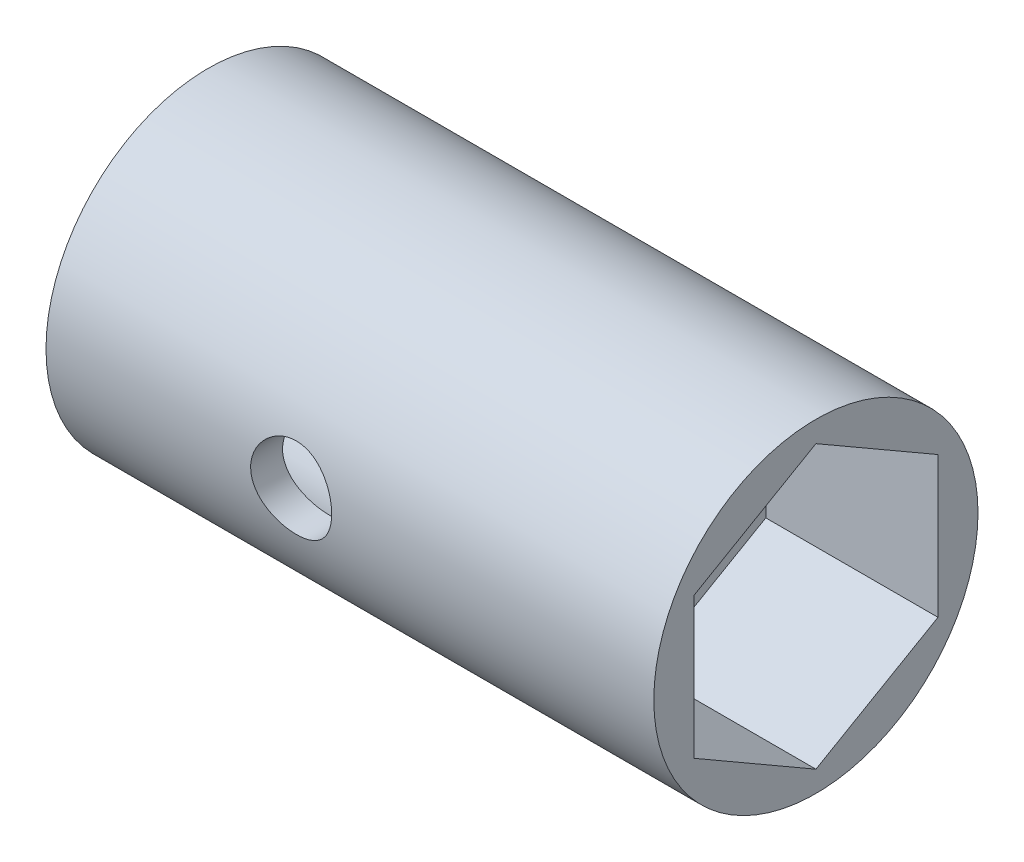
ISO-10303-21;
HEADER;
FILE_DESCRIPTION(('STEP AP214'),'2;1');
FILE_NAME('part.step','',(''),(''),'','','');
FILE_SCHEMA(('AUTOMOTIVE_DESIGN { 1 0 10303 214 1 1 1 1 }'));
ENDSEC;
DATA;
#1=APPLICATION_CONTEXT('core data for automotive mechanical design processes');
#2=APPLICATION_PROTOCOL_DEFINITION('international standard','automotive_design',2000,#1);
#3=PRODUCT_CONTEXT('',#1,'mechanical');
#4=PRODUCT('Part','Part','',(#3));
#5=PRODUCT_RELATED_PRODUCT_CATEGORY('part','',(#4));
#6=PRODUCT_DEFINITION_FORMATION('','',#4);
#7=PRODUCT_DEFINITION_CONTEXT('part definition',#1,'design');
#8=PRODUCT_DEFINITION('design','',#6,#7);
#9=PRODUCT_DEFINITION_SHAPE('','',#8);
#10=(LENGTH_UNIT() NAMED_UNIT(*) SI_UNIT(.MILLI.,.METRE.));
#11=(NAMED_UNIT(*) PLANE_ANGLE_UNIT() SI_UNIT($,.RADIAN.));
#12=(NAMED_UNIT(*) SI_UNIT($,.STERADIAN.) SOLID_ANGLE_UNIT());
#13=UNCERTAINTY_MEASURE_WITH_UNIT(LENGTH_MEASURE(1.E-05),#10,'distance_accuracy_value','');
#14=(GEOMETRIC_REPRESENTATION_CONTEXT(3) GLOBAL_UNCERTAINTY_ASSIGNED_CONTEXT((#13)) GLOBAL_UNIT_ASSIGNED_CONTEXT((#10,
#11,#12)) REPRESENTATION_CONTEXT('',''));
#15=CARTESIAN_POINT('',(0.,0.,0.));
#16=DIRECTION('',(0.,0.,1.));
#17=DIRECTION('',(1.,0.,0.));
#18=AXIS2_PLACEMENT_3D('',#15,#16,#17);
#19=CARTESIAN_POINT('',(20.,0.,0.));
#20=DIRECTION('',(-1.,0.,0.));
#21=DIRECTION('',(0.,0.,1.));
#22=AXIS2_PLACEMENT_3D('',#19,#20,#21);
#23=CYLINDRICAL_SURFACE('',#22,8.);
#24=CARTESIAN_POINT('',(20.,0.,0.));
#25=DIRECTION('',(1.,0.,0.));
#26=DIRECTION('',(0.,0.,-1.));
#27=AXIS2_PLACEMENT_3D('',#24,#25,#26);
#28=CIRCLE('',#27,8.);
#29=CARTESIAN_POINT('',(20.,0.,-8.));
#30=VERTEX_POINT('',#29);
#31=EDGE_CURVE('E11',#30,#30,#28,.T.);
#32=ORIENTED_EDGE('',*,*,#31,.F.);
#33=EDGE_LOOP('',(#32));
#34=FACE_BOUND('',#33,.T.);
#35=CARTESIAN_POINT('',(0.0999999999999998,0.,-8.));
#36=CARTESIAN_POINT('',(0.100003100984211,0.110501451559641,-7.9999981315735));
#37=CARTESIAN_POINT('',(0.10918873436505,0.221037543774351,-7.99768770842435));
#38=CARTESIAN_POINT('',(0.145633535076007,0.438941765027377,-7.98869485106526));
#39=CARTESIAN_POINT('',(0.172902946050467,0.546308062494319,-7.98200993893301));
#40=CARTESIAN_POINT('',(0.244585671282781,0.754694496243436,-7.96500835109376));
#41=CARTESIAN_POINT('',(0.288978398287026,0.855722084573336,-7.95469603789411));
#42=CARTESIAN_POINT('',(0.393575186726456,1.04889617587257,-7.93153791743495));
#43=CARTESIAN_POINT('',(0.453779781491956,1.14104237913168,-7.91869202472209));
#44=CARTESIAN_POINT('',(0.589601052872241,1.31573590306789,-7.89156551455591));
#45=CARTESIAN_POINT('',(0.665482099945414,1.39807425341474,-7.87726276197502));
#46=CARTESIAN_POINT('',(0.829936273212046,1.54899856960443,-7.84898160157248));
#47=CARTESIAN_POINT('',(0.918510830595915,1.61758298259892,-7.83500323053157));
#48=CARTESIAN_POINT('',(1.10746030231599,1.74003539039863,-7.80873034264225));
#49=CARTESIAN_POINT('',(1.20799097441164,1.79366962123352,-7.79646392619748));
#50=CARTESIAN_POINT('',(1.41699788221338,1.88319587806766,-7.77532659757355));
#51=CARTESIAN_POINT('',(1.52547284444269,1.91909074058685,-7.76645514259225));
#52=CARTESIAN_POINT('',(1.74499133093555,1.97140644907302,-7.7533396892843));
#53=CARTESIAN_POINT('',(1.85593986138399,1.98820302444274,-7.74900654662681));
#54=CARTESIAN_POINT('',(2.07915809199913,2.00301570008855,-7.74519149946122));
#55=CARTESIAN_POINT('',(2.19142757425618,2.00103485575748,-7.74570880570571));
#56=CARTESIAN_POINT('',(2.4112210769938,1.97864869951961,-7.75145607355756));
#57=CARTESIAN_POINT('',(2.51879416195377,1.95869112025418,-7.75657150676391));
#58=CARTESIAN_POINT('',(2.72901473454808,1.90163224920399,-7.77075612894758));
#59=CARTESIAN_POINT('',(2.83166187070523,1.86452973609252,-7.77982559958985));
#60=CARTESIAN_POINT('',(3.03031735500284,1.77385263724958,-7.80100151874212));
#61=CARTESIAN_POINT('',(3.12624822905276,1.72011555631056,-7.81313769959755));
#62=CARTESIAN_POINT('',(3.30789161300909,1.59780836801993,-7.83906281127988));
#63=CARTESIAN_POINT('',(3.39360233075634,1.52923566507845,-7.85285203112837));
#64=CARTESIAN_POINT('',(3.55493815425921,1.37688456624163,-7.88101174053188));
#65=CARTESIAN_POINT('',(3.63020598674847,1.29272834422115,-7.89538759304001));
#66=CARTESIAN_POINT('',(3.7656283232852,1.11281589000493,-7.92274620771675));
#67=CARTESIAN_POINT('',(3.82578236568475,1.01705930361059,-7.93572892732543));
#68=CARTESIAN_POINT('',(3.92940078163252,0.816154518241856,-7.9589030945892));
#69=CARTESIAN_POINT('',(3.97280712033924,0.710975190944831,-7.96908480170303));
#70=CARTESIAN_POINT('',(4.04122307427943,0.49450134419051,-7.98543889321888));
#71=CARTESIAN_POINT('',(4.06623620855752,0.383207998867312,-7.99161204452374));
#72=CARTESIAN_POINT('',(4.09661008741178,0.160719960520035,-7.999139990285));
#73=CARTESIAN_POINT('',(4.1024573681004,0.0495956266509453,-8.00061404677705));
#74=CARTESIAN_POINT('',(4.09566799725935,-0.172043833068678,-7.99891739752601));
#75=CARTESIAN_POINT('',(4.08303300960116,-0.282559012859461,-7.99574710989128));
#76=CARTESIAN_POINT('',(4.04003878881149,-0.498152358368656,-7.98519441503143));
#77=CARTESIAN_POINT('',(4.00994498203069,-0.603286825291673,-7.97787512247748));
#78=CARTESIAN_POINT('',(3.93319055462874,-0.807009723270015,-7.95984942178845));
#79=CARTESIAN_POINT('',(3.88652826091577,-0.905597492043513,-7.94914267159856));
#80=CARTESIAN_POINT('',(3.7770184948337,-1.0953641792398,-7.92524410568414));
#81=CARTESIAN_POINT('',(3.71389851680432,-1.18638058911444,-7.91201156489243));
#82=CARTESIAN_POINT('',(3.57361345493737,-1.35670215152433,-7.88459345583226));
#83=CARTESIAN_POINT('',(3.49644594717746,-1.43600527863068,-7.87040772335606));
#84=CARTESIAN_POINT('',(3.32799738554071,-1.58265409076364,-7.84225275947695));
#85=CARTESIAN_POINT('',(3.23641639599677,-1.64965849016271,-7.82829738916375));
#86=CARTESIAN_POINT('',(3.04302315404571,-1.7673476786836,-7.80257171169652));
#87=CARTESIAN_POINT('',(2.94121135605366,-1.81803319221058,-7.79080130756035));
#88=CARTESIAN_POINT('',(2.7307923701159,-1.90126856081239,-7.77090792979553));
#89=CARTESIAN_POINT('',(2.62222982887466,-1.93392586220542,-7.76276340389207));
#90=CARTESIAN_POINT('',(2.40092048281452,-1.98046087993837,-7.75102325453578));
#91=CARTESIAN_POINT('',(2.28817459862335,-1.99434270330488,-7.74742663626581));
#92=CARTESIAN_POINT('',(2.06517196819306,-2.00271812044533,-7.74526534938609));
#93=CARTESIAN_POINT('',(1.95493675316703,-1.99775719704016,-7.74655910304352));
#94=CARTESIAN_POINT('',(1.73692814844269,-1.96983637108382,-7.7537054534379));
#95=CARTESIAN_POINT('',(1.62915470931513,-1.94687683024903,-7.75955795855809));
#96=CARTESIAN_POINT('',(1.41972205457946,-1.88390842592373,-7.77508347576963));
#97=CARTESIAN_POINT('',(1.31803025967972,-1.84400187290717,-7.78473353648412));
#98=CARTESIAN_POINT('',(1.12271282304841,-1.74835321814009,-7.80677007633105));
#99=CARTESIAN_POINT('',(1.02908830241744,-1.69260892004558,-7.81915693494364));
#100=CARTESIAN_POINT('',(0.849927161330639,-1.56515699818285,-7.8456751235135));
#101=CARTESIAN_POINT('',(0.764665235434722,-1.49307088388301,-7.85984353109009));
#102=CARTESIAN_POINT('',(0.607270606939457,-1.33571916158631,-7.88810702995048));
#103=CARTESIAN_POINT('',(0.535141026516041,-1.25045042834819,-7.90220210302746));
#104=CARTESIAN_POINT('',(0.404784921913857,-1.06729011560345,-7.92903540863551));
#105=CARTESIAN_POINT('',(0.346833848437894,-0.969197896421849,-7.94174444487824));
#106=CARTESIAN_POINT('',(0.248336716079293,-0.764354746013968,-7.96406566633491));
#107=CARTESIAN_POINT('',(0.207778185801952,-0.657610084582319,-7.97368006933042));
#108=CARTESIAN_POINT('',(0.151237559560462,-0.459213670991295,-7.98730746087389));
#109=CARTESIAN_POINT('',(0.132065009262089,-0.368506894544091,-7.9920344673692));
#110=CARTESIAN_POINT('',(0.106445408504078,-0.185208095381711,-7.99838140309264));
#111=CARTESIAN_POINT('',(0.0999974009262649,-0.0926162149901548,-8.00000156601193));
#112=CARTESIAN_POINT('',(0.0999999999999998,0.,-8.));
#113=B_SPLINE_CURVE_WITH_KNOTS('',3,(#35,#36,#37,#38,#39,#40,#41,#42,#43,#44,#45,#46,#47,#48,
#49,#50,#51,#52,#53,#54,#55,#56,#57,#58,#59,#60,#61,#62,#63,#64,#65,#66,#67,#68,#69,#70,#71,#72,
#73,#74,#75,#76,#77,#78,#79,#80,#81,#82,#83,#84,#85,#86,#87,#88,#89,#90,#91,#92,#93,#94,#95,#96,
#97,#98,#99,#100,#101,#102,#103,#104,#105,#106,#107,#108,#109,#110,#111,#112),.UNSPECIFIED.,.T.,
.F.,(4,2,2,2,2,2,2,2,2,2,2,2,2,2,2,2,2,2,2,2,2,2,2,2,2,2,2,2,2,2,2,2,2,2,2,2,2,2,4),(0.,
0.33116494996252,0.662517650351866,0.993473203048141,1.32443992022577,1.66152580582852,
1.99864972773416,2.34078196727742,2.68285948225824,3.01808393468093,3.3532538415469,
3.68029996013785,4.00736937959146,4.337740371696,4.66816921119311,5.00802001296453,
5.34788119415424,5.6889097201658,6.02987298255951,6.36211078603463,6.69431868154751,
7.02160366023144,7.34892169767482,7.68204783424897,8.01523150681786,8.35659345610396,
8.69794025003772,9.03723006156476,9.37644564340971,9.70591707202578,10.0353818794581,
10.3628853408369,10.6904342418696,11.0265276855097,11.3627009303165,11.7049624733721,
12.0469781843289,12.3245632392729,12.6021274139515),.UNSPECIFIED.);
#114=CARTESIAN_POINT('',(0.0999999999999998,0.,-8.));
#115=VERTEX_POINT('',#114);
#116=EDGE_CURVE('E182',#115,#115,#113,.T.);
#117=ORIENTED_EDGE('',*,*,#116,.F.);
#118=EDGE_LOOP('',(#117));
#119=FACE_BOUND('',#118,.T.);
#120=CARTESIAN_POINT('',(4.1,0.,8.));
#121=CARTESIAN_POINT('',(4.09999689901579,0.110501451559641,7.9999981315735));
#122=CARTESIAN_POINT('',(4.09081126563495,0.221037543774351,7.99768770842435));
#123=CARTESIAN_POINT('',(4.05436646492399,0.438941765027377,7.98869485106526));
#124=CARTESIAN_POINT('',(4.02709705394953,0.546308062494319,7.98200993893301));
#125=CARTESIAN_POINT('',(3.95541432871722,0.754694496243436,7.96500835109376));
#126=CARTESIAN_POINT('',(3.91102160171297,0.855722084573337,7.95469603789411));
#127=CARTESIAN_POINT('',(3.80642481327354,1.04889617587257,7.93153791743495));
#128=CARTESIAN_POINT('',(3.74622021850804,1.14104237913168,7.91869202472209));
#129=CARTESIAN_POINT('',(3.61039894712776,1.31573590306789,7.89156551455591));
#130=CARTESIAN_POINT('',(3.53451790005459,1.39807425341474,7.87726276197502));
#131=CARTESIAN_POINT('',(3.37006372678795,1.54899856960443,7.84898160157248));
#132=CARTESIAN_POINT('',(3.28148916940409,1.61758298259892,7.83500323053157));
#133=CARTESIAN_POINT('',(3.09253969768401,1.74003539039863,7.80873034264225));
#134=CARTESIAN_POINT('',(2.99200902558836,1.79366962123352,7.79646392619748));
#135=CARTESIAN_POINT('',(2.78300211778662,1.88319587806766,7.77532659757355));
#136=CARTESIAN_POINT('',(2.67452715555731,1.91909074058685,7.76645514259225));
#137=CARTESIAN_POINT('',(2.45500866906445,1.97140644907302,7.7533396892843));
#138=CARTESIAN_POINT('',(2.34406013861601,1.98820302444274,7.74900654662681));
#139=CARTESIAN_POINT('',(2.12084190800087,2.00301570008855,7.74519149946122));
#140=CARTESIAN_POINT('',(2.00857242574382,2.00103485575748,7.74570880570571));
#141=CARTESIAN_POINT('',(1.7887789230062,1.97864869951961,7.75145607355756));
#142=CARTESIAN_POINT('',(1.68120583804623,1.95869112025418,7.75657150676391));
#143=CARTESIAN_POINT('',(1.47098526545192,1.90163224920399,7.77075612894758));
#144=CARTESIAN_POINT('',(1.36833812929477,1.86452973609252,7.77982559958985));
#145=CARTESIAN_POINT('',(1.16968264499716,1.77385263724958,7.80100151874212));
#146=CARTESIAN_POINT('',(1.07375177094724,1.72011555631056,7.81313769959755));
#147=CARTESIAN_POINT('',(0.892108386990906,1.59780836801993,7.83906281127988));
#148=CARTESIAN_POINT('',(0.806397669243665,1.52923566507845,7.85285203112837));
#149=CARTESIAN_POINT('',(0.645061845740794,1.37688456624163,7.88101174053188));
#150=CARTESIAN_POINT('',(0.569794013251532,1.29272834422115,7.89538759304001));
#151=CARTESIAN_POINT('',(0.434371676714796,1.11281589000493,7.92274620771675));
#152=CARTESIAN_POINT('',(0.374217634315246,1.01705930361059,7.93572892732543));
#153=CARTESIAN_POINT('',(0.270599218367485,0.816154518241856,7.9589030945892));
#154=CARTESIAN_POINT('',(0.227192879660763,0.710975190944831,7.96908480170303));
#155=CARTESIAN_POINT('',(0.15877692572057,0.49450134419051,7.98543889321888));
#156=CARTESIAN_POINT('',(0.133763791442483,0.383207998867313,7.99161204452374));
#157=CARTESIAN_POINT('',(0.103389912588216,0.160719960520036,7.999139990285));
#158=CARTESIAN_POINT('',(0.097542631899598,0.0495956266509466,8.00061404677705));
#159=CARTESIAN_POINT('',(0.104332002740649,-0.172043833068677,7.99891739752601));
#160=CARTESIAN_POINT('',(0.116966990398843,-0.28255901285946,7.99574710989128));
#161=CARTESIAN_POINT('',(0.159961211188506,-0.498152358368656,7.98519441503143));
#162=CARTESIAN_POINT('',(0.190055017969316,-0.603286825291673,7.97787512247748));
#163=CARTESIAN_POINT('',(0.266809445371262,-0.807009723270016,7.95984942178845));
#164=CARTESIAN_POINT('',(0.313471739084227,-0.905597492043513,7.94914267159856));
#165=CARTESIAN_POINT('',(0.422981505166304,-1.0953641792398,7.92524410568414));
#166=CARTESIAN_POINT('',(0.486101483195683,-1.18638058911444,7.91201156489243));
#167=CARTESIAN_POINT('',(0.626386545062626,-1.35670215152433,7.88459345583226));
#168=CARTESIAN_POINT('',(0.703554052822543,-1.43600527863068,7.87040772335606));
#169=CARTESIAN_POINT('',(0.872002614459285,-1.58265409076364,7.84225275947695));
#170=CARTESIAN_POINT('',(0.963583604003229,-1.64965849016271,7.82829738916375));
#171=CARTESIAN_POINT('',(1.15697684595429,-1.7673476786836,7.80257171169652));
#172=CARTESIAN_POINT('',(1.25878864394634,-1.81803319221058,7.79080130756035));
#173=CARTESIAN_POINT('',(1.4692076298841,-1.90126856081239,7.77090792979553));
#174=CARTESIAN_POINT('',(1.57777017112535,-1.93392586220542,7.76276340389207));
#175=CARTESIAN_POINT('',(1.79907951718548,-1.98046087993837,7.75102325453578));
#176=CARTESIAN_POINT('',(1.91182540137665,-1.99434270330488,7.74742663626581));
#177=CARTESIAN_POINT('',(2.13482803180694,-2.00271812044533,7.74526534938609));
#178=CARTESIAN_POINT('',(2.24506324683298,-1.99775719704016,7.74655910304351));
#179=CARTESIAN_POINT('',(2.46307185155731,-1.96983637108382,7.7537054534379));
#180=CARTESIAN_POINT('',(2.57084529068487,-1.94687683024903,7.75955795855809));
#181=CARTESIAN_POINT('',(2.78027794542055,-1.88390842592373,7.77508347576963));
#182=CARTESIAN_POINT('',(2.88196974032028,-1.84400187290717,7.78473353648412));
#183=CARTESIAN_POINT('',(3.07728717695159,-1.74835321814009,7.80677007633105));
#184=CARTESIAN_POINT('',(3.17091169758256,-1.69260892004558,7.81915693494364));
#185=CARTESIAN_POINT('',(3.35007283866936,-1.56515699818285,7.8456751235135));
#186=CARTESIAN_POINT('',(3.43533476456528,-1.49307088388301,7.85984353109009));
#187=CARTESIAN_POINT('',(3.59272939306054,-1.33571916158631,7.88810702995048));
#188=CARTESIAN_POINT('',(3.66485897348396,-1.25045042834819,7.90220210302746));
#189=CARTESIAN_POINT('',(3.79521507808614,-1.06729011560345,7.92903540863551));
#190=CARTESIAN_POINT('',(3.85316615156211,-0.969197896421848,7.94174444487824));
#191=CARTESIAN_POINT('',(3.95166328392071,-0.764354746013968,7.96406566633491));
#192=CARTESIAN_POINT('',(3.99222181419805,-0.657610084582319,7.97368006933042));
#193=CARTESIAN_POINT('',(4.04876244043954,-0.459213670991296,7.98730746087389));
#194=CARTESIAN_POINT('',(4.06793499073791,-0.368506894544092,7.9920344673692));
#195=CARTESIAN_POINT('',(4.09355459149592,-0.185208095381711,7.99838140309264));
#196=CARTESIAN_POINT('',(4.10000259907374,-0.0926162149901553,8.00000156601192));
#197=CARTESIAN_POINT('',(4.1,0.,8.));
#198=B_SPLINE_CURVE_WITH_KNOTS('',3,(#120,#121,#122,#123,#124,#125,#126,#127,#128,#129,#130,
#131,#132,#133,#134,#135,#136,#137,#138,#139,#140,#141,#142,#143,#144,#145,#146,#147,#148,#149,
#150,#151,#152,#153,#154,#155,#156,#157,#158,#159,#160,#161,#162,#163,#164,#165,#166,#167,#168,
#169,#170,#171,#172,#173,#174,#175,#176,#177,#178,#179,#180,#181,#182,#183,#184,#185,#186,#187,
#188,#189,#190,#191,#192,#193,#194,#195,#196,#197),.UNSPECIFIED.,.T.,.F.,(4,2,2,2,2,2,2,2,2,2,2,
2,2,2,2,2,2,2,2,2,2,2,2,2,2,2,2,2,2,2,2,2,2,2,2,2,2,2,4),(0.,0.33116494996252,0.662517650351866,
0.993473203048142,1.32443992022577,1.66152580582852,1.99864972773416,2.34078196727742,
2.68285948225824,3.01808393468093,3.3532538415469,3.68029996013785,4.00736937959146,
4.337740371696,4.66816921119311,5.00802001296454,5.34788119415424,5.6889097201658,
6.02987298255951,6.36211078603463,6.69431868154752,7.02160366023144,7.34892169767482,
7.68204783424897,8.01523150681786,8.35659345610396,8.69794025003772,9.03723006156476,
9.37644564340972,9.70591707202578,10.0353818794581,10.3628853408369,10.6904342418696,
11.0265276855097,11.3627009303165,11.7049624733721,12.0469781843289,12.3245632392729,
12.6021274139515),.UNSPECIFIED.);
#199=CARTESIAN_POINT('',(4.1,0.,8.));
#200=VERTEX_POINT('',#199);
#201=EDGE_CURVE('E176',#200,#200,#198,.T.);
#202=ORIENTED_EDGE('',*,*,#201,.F.);
#203=EDGE_LOOP('',(#202));
#204=FACE_BOUND('',#203,.T.);
#205=CARTESIAN_POINT('',(-10.,0.,0.));
#206=DIRECTION('',(-1.,0.,0.));
#207=DIRECTION('',(0.,0.,1.));
#208=AXIS2_PLACEMENT_3D('',#205,#206,#207);
#209=CIRCLE('',#208,8.);
#210=CARTESIAN_POINT('',(-10.,0.,8.));
#211=VERTEX_POINT('',#210);
#212=EDGE_CURVE('E157',#211,#211,#209,.T.);
#213=ORIENTED_EDGE('',*,*,#212,.F.);
#214=EDGE_LOOP('',(#213));
#215=FACE_BOUND('',#214,.T.);
#216=ADVANCED_FACE('F39',(#34,#119,#204,#215),#23,.T.);
#217=CARTESIAN_POINT('',(9.,0.,0.));
#218=DIRECTION('',(-1.,0.,0.));
#219=DIRECTION('',(0.,0.,1.));
#220=AXIS2_PLACEMENT_3D('',#217,#218,#219);
#221=CYLINDRICAL_SURFACE('',#220,6.425);
#222=CARTESIAN_POINT('',(9.,0.,0.));
#223=DIRECTION('',(-1.,0.,0.));
#224=DIRECTION('',(0.,0.,1.));
#225=AXIS2_PLACEMENT_3D('',#222,#223,#224);
#226=CIRCLE('',#225,6.425);
#227=CARTESIAN_POINT('',(9.,0.,6.425));
#228=VERTEX_POINT('',#227);
#229=EDGE_CURVE('E135',#228,#228,#226,.T.);
#230=ORIENTED_EDGE('',*,*,#229,.F.);
#231=EDGE_LOOP('',(#230));
#232=FACE_BOUND('',#231,.T.);
#233=CARTESIAN_POINT('',(0.0999999999999998,0.,-6.425));
#234=CARTESIAN_POINT('',(0.100000778035508,-0.109523991360308,-6.42499941189041));
#235=CARTESIAN_POINT('',(0.109026291823222,-0.219056066483595,-6.42217302530847));
#236=CARTESIAN_POINT('',(0.144796136363435,-0.434918378345523,-6.41117484000838));
#237=CARTESIAN_POINT('',(0.171544602853544,-0.541247861687544,-6.40300179362668));
#238=CARTESIAN_POINT('',(0.241771902172259,-0.747560940122801,-6.3822034009673));
#239=CARTESIAN_POINT('',(0.285224957755411,-0.847554037471583,-6.36958491704452));
#240=CARTESIAN_POINT('',(0.387518682500118,-1.03883472800859,-6.34119937938537));
#241=CARTESIAN_POINT('',(0.446361739907693,-1.13012096704903,-6.32543183706273));
#242=CARTESIAN_POINT('',(0.579665103754873,-1.30419686783038,-6.29188178182186));
#243=CARTESIAN_POINT('',(0.654512080927549,-1.3866819833899,-6.27405562434277));
#244=CARTESIAN_POINT('',(0.816875268135391,-1.53815527743486,-6.23865099743644));
#245=CARTESIAN_POINT('',(0.904393808599024,-1.60714096773986,-6.22107257422401));
#246=CARTESIAN_POINT('',(1.0922463765786,-1.73130368644054,-6.18768603867693));
#247=CARTESIAN_POINT('',(1.19284178571602,-1.78610112458394,-6.17193183040883));
#248=CARTESIAN_POINT('',(1.40238982719294,-1.87787464339377,-6.14463350183632));
#249=CARTESIAN_POINT('',(1.51134026884759,-1.91485537719599,-6.13308828247461));
#250=CARTESIAN_POINT('',(1.73107072876491,-1.96883296843195,-6.11597148080434));
#251=CARTESIAN_POINT('',(1.84169857627352,-1.98639441812229,-6.11023156800952));
#252=CARTESIAN_POINT('',(2.06446786498636,-2.00279871375568,-6.1048753964408));
#253=CARTESIAN_POINT('',(2.17660889959649,-2.00164649179585,-6.10525752416711));
#254=CARTESIAN_POINT('',(2.39455884085638,-1.98109792471713,-6.1119536146639));
#255=CARTESIAN_POINT('',(2.50044368065734,-1.9624182651815,-6.11803454509422));
#256=CARTESIAN_POINT('',(2.70749487403187,-1.90850667218353,-6.13506466102689));
#257=CARTESIAN_POINT('',(2.80866072844806,-1.87327299204093,-6.14601436024577));
#258=CARTESIAN_POINT('',(3.00511403448591,-1.78674524516251,-6.17172758358949));
#259=CARTESIAN_POINT('',(3.10029480133597,-1.73522540734241,-6.18654417652736));
#260=CARTESIAN_POINT('',(3.28089570841947,-1.61774461390359,-6.21829729903242));
#261=CARTESIAN_POINT('',(3.36631332106845,-1.55177993148711,-6.23523437520452));
#262=CARTESIAN_POINT('',(3.52901624887426,-1.40376093473656,-6.27025595354423));
#263=CARTESIAN_POINT('',(3.60576029717583,-1.32111466453995,-6.28835773615851));
#264=CARTESIAN_POINT('',(3.74443051732264,-1.14390010870127,-6.3229943787707));
#265=CARTESIAN_POINT('',(3.80635560835317,-1.04933095423599,-6.33952912442433));
#266=CARTESIAN_POINT('',(3.91399304347009,-0.849917855893358,-6.36933999665907));
#267=CARTESIAN_POINT('',(3.95957718011421,-0.745000558447451,-6.38259011338475));
#268=CARTESIAN_POINT('',(4.03228914702998,-0.528478833893727,-6.40415107631766));
#269=CARTESIAN_POINT('',(4.05942253616798,-0.416876431918989,-6.41246341009136));
#270=CARTESIAN_POINT('',(4.0935428310158,-0.194747584600029,-6.42297326833483));
#271=CARTESIAN_POINT('',(4.10126256176271,-0.0843440593346793,-6.425393104891));
#272=CARTESIAN_POINT('',(4.0984013946971,0.136192265552032,-6.42450229410207));
#273=CARTESIAN_POINT('',(4.08782314726312,0.246325102067583,-6.42119247667112));
#274=CARTESIAN_POINT('',(4.04925503684773,0.460373163467998,-6.40936027986571));
#275=CARTESIAN_POINT('',(4.02170045203983,0.564374718056013,-6.40096829762448));
#276=CARTESIAN_POINT('',(3.95049223377096,0.766250075858449,-6.37995254797857));
#277=CARTESIAN_POINT('',(3.90683661673743,0.864123122330505,-6.3673282591908));
#278=CARTESIAN_POINT('',(3.80348097985967,1.0536039532621,-6.33876589001128));
#279=CARTESIAN_POINT('',(3.74341739989001,1.1450021266097,-6.32275484386417));
#280=CARTESIAN_POINT('',(3.60938755809792,1.31666822098248,-6.28925051244425));
#281=CARTESIAN_POINT('',(3.53541755352514,1.39693313549234,-6.27175682883476));
#282=CARTESIAN_POINT('',(3.37222812955864,1.54732787197508,-6.2363939801335));
#283=CARTESIAN_POINT('',(3.28252368501898,1.61693547034565,-6.21853707416325));
#284=CARTESIAN_POINT('',(3.09231921597733,1.74015528744893,-6.18518985145746));
#285=CARTESIAN_POINT('',(2.99181937521657,1.79376777836502,-6.16969949445334));
#286=CARTESIAN_POINT('',(2.78309652167365,1.88313855217409,-6.14301181379288));
#287=CARTESIAN_POINT('',(2.67490606529391,1.91896750794594,-6.13179753861047));
#288=CARTESIAN_POINT('',(2.45360773287546,1.97177305581863,-6.11502400226241));
#289=CARTESIAN_POINT('',(2.34050172599225,1.98875674983417,-6.10946261085056));
#290=CARTESIAN_POINT('',(2.11803881650875,2.00288233084571,-6.10484530762487));
#291=CARTESIAN_POINT('',(2.00874142768701,2.00088037725016,-6.10550867503372));
#292=CARTESIAN_POINT('',(1.79212145966772,1.9791560001477,-6.11258489290321));
#293=CARTESIAN_POINT('',(1.68479878991472,1.95943439129492,-6.11899747904577));
#294=CARTESIAN_POINT('',(1.47669270202789,1.90340165934753,-6.13665420489988));
#295=CARTESIAN_POINT('',(1.37583733221762,1.8673337182189,-6.14782738103348));
#296=CARTESIAN_POINT('',(1.1815291709257,1.77982342088152,-6.17372872227518));
#297=CARTESIAN_POINT('',(1.08807788163139,1.72837795483535,-6.18845760634748));
#298=CARTESIAN_POINT('',(0.907299864058484,1.60923462397778,-6.22052490511596));
#299=CARTESIAN_POINT('',(0.820352241886145,1.54098289254001,-6.23794248243921));
#300=CARTESIAN_POINT('',(0.658866987259921,1.39114125203616,-6.27305859645029));
#301=CARTESIAN_POINT('',(0.584332674779031,1.30954778621407,-6.29075720691931));
#302=CARTESIAN_POINT('',(0.44738025423246,1.13216666863917,-6.32512714372732));
#303=CARTESIAN_POINT('',(0.38543140499204,1.03600559416997,-6.3417468054772));
#304=CARTESIAN_POINT('',(0.278661128846068,0.834116968554108,-6.37144089962813));
#305=CARTESIAN_POINT('',(0.233832840405593,0.728393270947349,-6.38451675169685));
#306=CARTESIAN_POINT('',(0.165907799281393,0.519856301890899,-6.40471552610836));
#307=CARTESIAN_POINT('',(0.14126315337143,0.417586226154458,-6.41225647267885));
#308=CARTESIAN_POINT('',(0.108310503064666,0.210212870700683,-6.42239850116744));
#309=CARTESIAN_POINT('',(0.0999992533194397,0.105110158019394,-6.42500056440869));
#310=CARTESIAN_POINT('',(0.0999999999999998,0.,-6.425));
#311=B_SPLINE_CURVE_WITH_KNOTS('',3,(#233,#234,#235,#236,#237,#238,#239,#240,#241,#242,#243,
#244,#245,#246,#247,#248,#249,#250,#251,#252,#253,#254,#255,#256,#257,#258,#259,#260,#261,#262,
#263,#264,#265,#266,#267,#268,#269,#270,#271,#272,#273,#274,#275,#276,#277,#278,#279,#280,#281,
#282,#283,#284,#285,#286,#287,#288,#289,#290,#291,#292,#293,#294,#295,#296,#297,#298,#299,#300,
#301,#302,#303,#304,#305,#306,#307,#308,#309,#310),.UNSPECIFIED.,.T.,.F.,(4,2,2,2,2,2,2,2,2,2,2,
2,2,2,2,2,2,2,2,2,2,2,2,2,2,2,2,2,2,2,2,2,2,2,2,2,2,2,4),(0.,0.328185648791235,
0.656447908292093,0.984205638801384,1.31201426150831,1.64888256745772,1.98581290577071,
2.33099547683906,2.67608784866464,3.01085932750759,3.34554257681024,3.66711089020439,
3.98871314116721,4.31498511245977,4.64134136193903,4.98243193490186,5.32354737759158,
5.6672834028054,6.01091582082258,6.34136778455572,6.67177188783943,6.99403789987709,
7.31634362686253,7.64646886853578,7.97668308705414,8.3198736421205,8.66305835689486,
9.00486809059988,9.34654896810113,9.67289767172262,9.9992313723595,10.3208619974389,
10.6425577107855,10.9767541569609,11.3110398418328,11.6561258075973,12.0010733251864,
12.3160956423093,12.6310553600451),.UNSPECIFIED.);
#312=CARTESIAN_POINT('',(0.0999999999999998,0.,-6.425));
#313=VERTEX_POINT('',#312);
#314=EDGE_CURVE('E152',#313,#313,#311,.T.);
#315=ORIENTED_EDGE('',*,*,#314,.F.);
#316=EDGE_LOOP('',(#315));
#317=FACE_BOUND('',#316,.T.);
#318=CARTESIAN_POINT('',(4.1,0.,6.425));
#319=CARTESIAN_POINT('',(4.09999922196449,-0.109523991360308,6.42499941189041));
#320=CARTESIAN_POINT('',(4.09097370817678,-0.219056066483594,6.42217302530847));
#321=CARTESIAN_POINT('',(4.05520386363657,-0.434918378345522,6.41117484000838));
#322=CARTESIAN_POINT('',(4.02845539714646,-0.541247861687543,6.40300179362668));
#323=CARTESIAN_POINT('',(3.95822809782774,-0.747560940122801,6.3822034009673));
#324=CARTESIAN_POINT('',(3.91477504224459,-0.847554037471582,6.36958491704452));
#325=CARTESIAN_POINT('',(3.81248131749988,-1.03883472800859,6.34119937938537));
#326=CARTESIAN_POINT('',(3.75363826009231,-1.13012096704903,6.32543183706273));
#327=CARTESIAN_POINT('',(3.62033489624513,-1.30419686783038,6.29188178182186));
#328=CARTESIAN_POINT('',(3.54548791907245,-1.3866819833899,6.27405562434277));
#329=CARTESIAN_POINT('',(3.38312473186461,-1.53815527743486,6.23865099743644));
#330=CARTESIAN_POINT('',(3.29560619140098,-1.60714096773986,6.22107257422401));
#331=CARTESIAN_POINT('',(3.10775362342141,-1.73130368644054,6.18768603867693));
#332=CARTESIAN_POINT('',(3.00715821428398,-1.78610112458394,6.17193183040884));
#333=CARTESIAN_POINT('',(2.79761017280706,-1.87787464339377,6.14463350183632));
#334=CARTESIAN_POINT('',(2.68865973115241,-1.91485537719599,6.13308828247461));
#335=CARTESIAN_POINT('',(2.46892927123509,-1.96883296843195,6.11597148080434));
#336=CARTESIAN_POINT('',(2.35830142372648,-1.98639441812229,6.11023156800952));
#337=CARTESIAN_POINT('',(2.13553213501364,-2.00279871375568,6.1048753964408));
#338=CARTESIAN_POINT('',(2.02339110040351,-2.00164649179585,6.10525752416711));
#339=CARTESIAN_POINT('',(1.80544115914362,-1.98109792471713,6.1119536146639));
#340=CARTESIAN_POINT('',(1.69955631934266,-1.9624182651815,6.11803454509422));
#341=CARTESIAN_POINT('',(1.49250512596813,-1.90850667218353,6.13506466102689));
#342=CARTESIAN_POINT('',(1.39133927155194,-1.87327299204093,6.14601436024577));
#343=CARTESIAN_POINT('',(1.1948859655141,-1.78674524516251,6.17172758358949));
#344=CARTESIAN_POINT('',(1.09970519866403,-1.73522540734241,6.18654417652736));
#345=CARTESIAN_POINT('',(0.919104291580535,-1.6177446139036,6.21829729903242));
#346=CARTESIAN_POINT('',(0.833686678931553,-1.55177993148711,6.23523437520452));
#347=CARTESIAN_POINT('',(0.670983751125746,-1.40376093473656,6.27025595354423));
#348=CARTESIAN_POINT('',(0.594239702824167,-1.32111466453995,6.28835773615851));
#349=CARTESIAN_POINT('',(0.455569482677366,-1.14390010870127,6.3229943787707));
#350=CARTESIAN_POINT('',(0.393644391646832,-1.04933095423599,6.33952912442433));
#351=CARTESIAN_POINT('',(0.286006956529914,-0.849917855893358,6.36933999665907));
#352=CARTESIAN_POINT('',(0.24042281988579,-0.745000558447451,6.38259011338475));
#353=CARTESIAN_POINT('',(0.167710852970022,-0.528478833893728,6.40415107631766));
#354=CARTESIAN_POINT('',(0.140577463832018,-0.41687643191899,6.41246341009136));
#355=CARTESIAN_POINT('',(0.106457168984201,-0.19474758460003,6.42297326833483));
#356=CARTESIAN_POINT('',(0.0987374382372927,-0.0843440593346805,6.425393104891));
#357=CARTESIAN_POINT('',(0.101598605302906,0.136192265552031,6.42450229410207));
#358=CARTESIAN_POINT('',(0.112176852736878,0.246325102067582,6.42119247667112));
#359=CARTESIAN_POINT('',(0.150744963152269,0.460373163467997,6.40936027986571));
#360=CARTESIAN_POINT('',(0.178299547960168,0.564374718056012,6.40096829762448));
#361=CARTESIAN_POINT('',(0.249507766229045,0.766250075858447,6.37995254797857));
#362=CARTESIAN_POINT('',(0.293163383262573,0.864123122330504,6.3673282591908));
#363=CARTESIAN_POINT('',(0.396519020140334,1.0536039532621,6.33876589001128));
#364=CARTESIAN_POINT('',(0.456582600109988,1.1450021266097,6.32275484386417));
#365=CARTESIAN_POINT('',(0.590612441902083,1.31666822098248,6.28925051244425));
#366=CARTESIAN_POINT('',(0.664582446474857,1.39693313549234,6.27175682883476));
#367=CARTESIAN_POINT('',(0.827771870441357,1.54732787197508,6.2363939801335));
#368=CARTESIAN_POINT('',(0.917476314981022,1.61693547034565,6.21853707416325));
#369=CARTESIAN_POINT('',(1.10768078402268,1.74015528744893,6.18518985145746));
#370=CARTESIAN_POINT('',(1.20818062478343,1.79376777836502,6.16969949445334));
#371=CARTESIAN_POINT('',(1.41690347832635,1.88313855217409,6.14301181379288));
#372=CARTESIAN_POINT('',(1.52509393470609,1.91896750794594,6.13179753861047));
#373=CARTESIAN_POINT('',(1.74639226712454,1.97177305581863,6.11502400226242));
#374=CARTESIAN_POINT('',(1.85949827400775,1.98875674983417,6.10946261085056));
#375=CARTESIAN_POINT('',(2.08196118349125,2.00288233084571,6.10484530762487));
#376=CARTESIAN_POINT('',(2.19125857231299,2.00088037725016,6.10550867503372));
#377=CARTESIAN_POINT('',(2.40787854033228,1.9791560001477,6.11258489290321));
#378=CARTESIAN_POINT('',(2.51520121008528,1.95943439129492,6.11899747904577));
#379=CARTESIAN_POINT('',(2.72330729797211,1.90340165934753,6.13665420489988));
#380=CARTESIAN_POINT('',(2.82416266778238,1.8673337182189,6.14782738103348));
#381=CARTESIAN_POINT('',(3.0184708290743,1.77982342088152,6.17372872227518));
#382=CARTESIAN_POINT('',(3.11192211836861,1.72837795483535,6.18845760634748));
#383=CARTESIAN_POINT('',(3.29270013594151,1.60923462397778,6.22052490511596));
#384=CARTESIAN_POINT('',(3.37964775811385,1.54098289254001,6.23794248243921));
#385=CARTESIAN_POINT('',(3.54113301274008,1.39114125203616,6.27305859645029));
#386=CARTESIAN_POINT('',(3.61566732522097,1.30954778621407,6.29075720691931));
#387=CARTESIAN_POINT('',(3.75261974576754,1.13216666863917,6.32512714372732));
#388=CARTESIAN_POINT('',(3.81456859500796,1.03600559416997,6.34174680547719));
#389=CARTESIAN_POINT('',(3.92133887115393,0.834116968554111,6.37144089962812));
#390=CARTESIAN_POINT('',(3.96616715959441,0.728393270947351,6.38451675169685));
#391=CARTESIAN_POINT('',(4.03409220071861,0.5198563018909,6.40471552610836));
#392=CARTESIAN_POINT('',(4.05873684662857,0.417586226154459,6.41225647267885));
#393=CARTESIAN_POINT('',(4.09168949693534,0.210212870700683,6.42239850116744));
#394=CARTESIAN_POINT('',(4.10000074668056,0.105110158019394,6.42500056440869));
#395=CARTESIAN_POINT('',(4.1,0.,6.425));
#396=B_SPLINE_CURVE_WITH_KNOTS('',3,(#318,#319,#320,#321,#322,#323,#324,#325,#326,#327,#328,
#329,#330,#331,#332,#333,#334,#335,#336,#337,#338,#339,#340,#341,#342,#343,#344,#345,#346,#347,
#348,#349,#350,#351,#352,#353,#354,#355,#356,#357,#358,#359,#360,#361,#362,#363,#364,#365,#366,
#367,#368,#369,#370,#371,#372,#373,#374,#375,#376,#377,#378,#379,#380,#381,#382,#383,#384,#385,
#386,#387,#388,#389,#390,#391,#392,#393,#394,#395),.UNSPECIFIED.,.T.,.F.,(4,2,2,2,2,2,2,2,2,2,2,
2,2,2,2,2,2,2,2,2,2,2,2,2,2,2,2,2,2,2,2,2,2,2,2,2,2,2,4),(0.,0.328185648791234,
0.656447908292093,0.984205638801383,1.31201426150831,1.64888256745772,1.98581290577071,
2.33099547683905,2.67608784866464,3.01085932750759,3.34554257681024,3.66711089020439,
3.98871314116721,4.31498511245977,4.64134136193902,4.98243193490186,5.32354737759158,
5.6672834028054,6.01091582082258,6.34136778455572,6.67177188783943,6.99403789987709,
7.31634362686253,7.64646886853578,7.97668308705414,8.3198736421205,8.66305835689486,
9.00486809059987,9.34654896810113,9.67289767172262,9.9992313723595,10.3208619974389,
10.6425577107855,10.9767541569609,11.3110398418328,11.6561258075973,12.0010733251864,
12.3160956423093,12.6310553600451),.UNSPECIFIED.);
#397=CARTESIAN_POINT('',(4.1,0.,6.425));
#398=VERTEX_POINT('',#397);
#399=EDGE_CURVE('E43',#398,#398,#396,.T.);
#400=ORIENTED_EDGE('',*,*,#399,.F.);
#401=EDGE_LOOP('',(#400));
#402=FACE_BOUND('',#401,.T.);
#403=CARTESIAN_POINT('',(-10.,0.,0.));
#404=DIRECTION('',(-1.,0.,0.));
#405=DIRECTION('',(0.,0.,1.));
#406=AXIS2_PLACEMENT_3D('',#403,#404,#405);
#407=CIRCLE('',#406,6.425);
#408=CARTESIAN_POINT('',(-10.,0.,6.425));
#409=VERTEX_POINT('',#408);
#410=EDGE_CURVE('E233',#409,#409,#407,.T.);
#411=ORIENTED_EDGE('',*,*,#410,.T.);
#412=EDGE_LOOP('',(#411));
#413=FACE_BOUND('',#412,.T.);
#414=ADVANCED_FACE('F158',(#232,#317,#402,#413),#221,.F.);
#415=CARTESIAN_POINT('',(20.,0.,0.));
#416=DIRECTION('',(1.,0.,0.));
#417=DIRECTION('',(0.,0.,-1.));
#418=AXIS2_PLACEMENT_3D('',#415,#416,#417);
#419=PLANE('',#418);
#420=DIRECTION('',(0.,-0.5,-0.866025403784439));
#421=VECTOR('',#420,1.);
#422=CARTESIAN_POINT('',(20.,-3.4785353718675,6.025));
#423=LINE('',#422,#421);
#424=CARTESIAN_POINT('',(20.,-3.4785353718675,6.025));
#425=VERTEX_POINT('',#424);
#426=CARTESIAN_POINT('',(20.,-6.95707074373499,0.));
#427=VERTEX_POINT('',#426);
#428=EDGE_CURVE('E61',#425,#427,#423,.T.);
#429=ORIENTED_EDGE('',*,*,#428,.F.);
#430=DIRECTION('',(0.,-1.,0.));
#431=VECTOR('',#430,1.);
#432=CARTESIAN_POINT('',(20.,3.4785353718675,6.025));
#433=LINE('',#432,#431);
#434=CARTESIAN_POINT('',(20.,3.4785353718675,6.025));
#435=VERTEX_POINT('',#434);
#436=EDGE_CURVE('E144',#435,#425,#433,.T.);
#437=ORIENTED_EDGE('',*,*,#436,.F.);
#438=DIRECTION('',(0.,-0.5,0.866025403784439));
#439=VECTOR('',#438,1.);
#440=CARTESIAN_POINT('',(20.,6.95707074373499,0.));
#441=LINE('',#440,#439);
#442=CARTESIAN_POINT('',(20.,6.95707074373499,0.));
#443=VERTEX_POINT('',#442);
#444=EDGE_CURVE('E142',#443,#435,#441,.T.);
#445=ORIENTED_EDGE('',*,*,#444,.F.);
#446=DIRECTION('',(0.,0.5,0.866025403784439));
#447=VECTOR('',#446,1.);
#448=CARTESIAN_POINT('',(20.,3.4785353718675,-6.025));
#449=LINE('',#448,#447);
#450=CARTESIAN_POINT('',(20.,3.4785353718675,-6.025));
#451=VERTEX_POINT('',#450);
#452=EDGE_CURVE('E108',#451,#443,#449,.T.);
#453=ORIENTED_EDGE('',*,*,#452,.F.);
#454=DIRECTION('',(0.,1.,0.));
#455=VECTOR('',#454,1.);
#456=CARTESIAN_POINT('',(20.,-3.4785353718675,-6.025));
#457=LINE('',#456,#455);
#458=CARTESIAN_POINT('',(20.,-3.4785353718675,-6.025));
#459=VERTEX_POINT('',#458);
#460=EDGE_CURVE('E138',#459,#451,#457,.T.);
#461=ORIENTED_EDGE('',*,*,#460,.F.);
#462=DIRECTION('',(0.,0.5,-0.866025403784439));
#463=VECTOR('',#462,1.);
#464=CARTESIAN_POINT('',(20.,-6.95707074373499,0.));
#465=LINE('',#464,#463);
#466=EDGE_CURVE('E134',#427,#459,#465,.T.);
#467=ORIENTED_EDGE('',*,*,#466,.F.);
#468=EDGE_LOOP('',(#429,#437,#445,#453,#461,#467));
#469=FACE_BOUND('',#468,.T.);
#470=ORIENTED_EDGE('',*,*,#31,.T.);
#471=EDGE_LOOP('',(#470));
#472=FACE_BOUND('',#471,.T.);
#473=ADVANCED_FACE('F204',(#469,#472),#419,.T.);
#474=CARTESIAN_POINT('',(11.5,-3.4785353718675,6.025));
#475=DIRECTION('',(0.,-0.866025403784439,0.5));
#476=DIRECTION('',(0.,-0.5,-0.866025403784439));
#477=AXIS2_PLACEMENT_3D('',#474,#475,#476);
#478=PLANE('',#477);
#479=ORIENTED_EDGE('',*,*,#428,.T.);
#480=DIRECTION('',(1.,0.,0.));
#481=VECTOR('',#480,1.);
#482=CARTESIAN_POINT('',(11.5,-6.95707074373499,0.));
#483=LINE('',#482,#481);
#484=CARTESIAN_POINT('',(11.5,-6.95707074373499,0.));
#485=VERTEX_POINT('',#484);
#486=EDGE_CURVE('E90',#485,#427,#483,.T.);
#487=ORIENTED_EDGE('',*,*,#486,.F.);
#488=DIRECTION('',(0.,-0.5,-0.866025403784439));
#489=VECTOR('',#488,1.);
#490=CARTESIAN_POINT('',(11.5,-3.4785353718675,6.025));
#491=LINE('',#490,#489);
#492=CARTESIAN_POINT('',(11.5,-3.4785353718675,6.025));
#493=VERTEX_POINT('',#492);
#494=EDGE_CURVE('E146',#493,#485,#491,.T.);
#495=ORIENTED_EDGE('',*,*,#494,.F.);
#496=DIRECTION('',(1.,0.,0.));
#497=VECTOR('',#496,1.);
#498=CARTESIAN_POINT('',(11.5,-3.4785353718675,6.025));
#499=LINE('',#498,#497);
#500=EDGE_CURVE('E53',#493,#425,#499,.T.);
#501=ORIENTED_EDGE('',*,*,#500,.T.);
#502=EDGE_LOOP('',(#479,#487,#495,#501));
#503=FACE_BOUND('',#502,.T.);
#504=ADVANCED_FACE('F209',(#503),#478,.F.);
#505=CARTESIAN_POINT('',(11.5,3.4785353718675,6.025));
#506=DIRECTION('',(0.,0.,1.));
#507=DIRECTION('',(0.,-1.,0.));
#508=AXIS2_PLACEMENT_3D('',#505,#506,#507);
#509=PLANE('',#508);
#510=ORIENTED_EDGE('',*,*,#436,.T.);
#511=ORIENTED_EDGE('',*,*,#500,.F.);
#512=DIRECTION('',(0.,-1.,0.));
#513=VECTOR('',#512,1.);
#514=CARTESIAN_POINT('',(11.5,3.4785353718675,6.025));
#515=LINE('',#514,#513);
#516=CARTESIAN_POINT('',(11.5,3.4785353718675,6.025));
#517=VERTEX_POINT('',#516);
#518=EDGE_CURVE('E120',#517,#493,#515,.T.);
#519=ORIENTED_EDGE('',*,*,#518,.F.);
#520=DIRECTION('',(1.,0.,0.));
#521=VECTOR('',#520,1.);
#522=CARTESIAN_POINT('',(11.5,3.4785353718675,6.025));
#523=LINE('',#522,#521);
#524=EDGE_CURVE('E112',#517,#435,#523,.T.);
#525=ORIENTED_EDGE('',*,*,#524,.T.);
#526=EDGE_LOOP('',(#510,#511,#519,#525));
#527=FACE_BOUND('',#526,.T.);
#528=ADVANCED_FACE('F207',(#527),#509,.F.);
#529=CARTESIAN_POINT('',(11.5,6.95707074373499,0.));
#530=DIRECTION('',(0.,0.866025403784439,0.5));
#531=DIRECTION('',(0.,-0.5,0.866025403784439));
#532=AXIS2_PLACEMENT_3D('',#529,#530,#531);
#533=PLANE('',#532);
#534=ORIENTED_EDGE('',*,*,#444,.T.);
#535=ORIENTED_EDGE('',*,*,#524,.F.);
#536=DIRECTION('',(0.,-0.5,0.866025403784439));
#537=VECTOR('',#536,1.);
#538=CARTESIAN_POINT('',(11.5,6.95707074373499,0.));
#539=LINE('',#538,#537);
#540=CARTESIAN_POINT('',(11.5,6.95707074373499,0.));
#541=VERTEX_POINT('',#540);
#542=EDGE_CURVE('E116',#541,#517,#539,.T.);
#543=ORIENTED_EDGE('',*,*,#542,.F.);
#544=DIRECTION('',(1.,0.,0.));
#545=VECTOR('',#544,1.);
#546=CARTESIAN_POINT('',(11.5,6.95707074373499,0.));
#547=LINE('',#546,#545);
#548=EDGE_CURVE('E101',#541,#443,#547,.T.);
#549=ORIENTED_EDGE('',*,*,#548,.T.);
#550=EDGE_LOOP('',(#534,#535,#543,#549));
#551=FACE_BOUND('',#550,.T.);
#552=ADVANCED_FACE('F117',(#551),#533,.F.);
#553=CARTESIAN_POINT('',(11.5,3.4785353718675,-6.025));
#554=DIRECTION('',(0.,0.866025403784439,-0.5));
#555=DIRECTION('',(0.,0.5,0.866025403784439));
#556=AXIS2_PLACEMENT_3D('',#553,#554,#555);
#557=PLANE('',#556);
#558=ORIENTED_EDGE('',*,*,#452,.T.);
#559=ORIENTED_EDGE('',*,*,#548,.F.);
#560=DIRECTION('',(0.,0.5,0.866025403784439));
#561=VECTOR('',#560,1.);
#562=CARTESIAN_POINT('',(11.5,3.4785353718675,-6.025));
#563=LINE('',#562,#561);
#564=CARTESIAN_POINT('',(11.5,3.4785353718675,-6.025));
#565=VERTEX_POINT('',#564);
#566=EDGE_CURVE('E105',#565,#541,#563,.T.);
#567=ORIENTED_EDGE('',*,*,#566,.F.);
#568=DIRECTION('',(1.,0.,0.));
#569=VECTOR('',#568,1.);
#570=CARTESIAN_POINT('',(11.5,3.4785353718675,-6.025));
#571=LINE('',#570,#569);
#572=EDGE_CURVE('E113',#565,#451,#571,.T.);
#573=ORIENTED_EDGE('',*,*,#572,.T.);
#574=EDGE_LOOP('',(#558,#559,#567,#573));
#575=FACE_BOUND('',#574,.T.);
#576=ADVANCED_FACE('F103',(#575),#557,.F.);
#577=CARTESIAN_POINT('',(11.5,-3.4785353718675,-6.025));
#578=DIRECTION('',(0.,0.,-1.));
#579=DIRECTION('',(0.,1.,0.));
#580=AXIS2_PLACEMENT_3D('',#577,#578,#579);
#581=PLANE('',#580);
#582=ORIENTED_EDGE('',*,*,#460,.T.);
#583=ORIENTED_EDGE('',*,*,#572,.F.);
#584=DIRECTION('',(0.,1.,0.));
#585=VECTOR('',#584,1.);
#586=CARTESIAN_POINT('',(11.5,-3.4785353718675,-6.025));
#587=LINE('',#586,#585);
#588=CARTESIAN_POINT('',(11.5,-3.4785353718675,-6.025));
#589=VERTEX_POINT('',#588);
#590=EDGE_CURVE('E126',#589,#565,#587,.T.);
#591=ORIENTED_EDGE('',*,*,#590,.F.);
#592=DIRECTION('',(1.,0.,0.));
#593=VECTOR('',#592,1.);
#594=CARTESIAN_POINT('',(11.5,-3.4785353718675,-6.025));
#595=LINE('',#594,#593);
#596=EDGE_CURVE('E150',#589,#459,#595,.T.);
#597=ORIENTED_EDGE('',*,*,#596,.T.);
#598=EDGE_LOOP('',(#582,#583,#591,#597));
#599=FACE_BOUND('',#598,.T.);
#600=ADVANCED_FACE('F202',(#599),#581,.F.);
#601=CARTESIAN_POINT('',(11.5,-6.95707074373499,0.));
#602=DIRECTION('',(0.,-0.866025403784439,-0.5));
#603=DIRECTION('',(0.,0.5,-0.866025403784439));
#604=AXIS2_PLACEMENT_3D('',#601,#602,#603);
#605=PLANE('',#604);
#606=ORIENTED_EDGE('',*,*,#466,.T.);
#607=ORIENTED_EDGE('',*,*,#596,.F.);
#608=DIRECTION('',(0.,0.5,-0.866025403784439));
#609=VECTOR('',#608,1.);
#610=CARTESIAN_POINT('',(11.5,-6.95707074373499,0.));
#611=LINE('',#610,#609);
#612=EDGE_CURVE('E128',#485,#589,#611,.T.);
#613=ORIENTED_EDGE('',*,*,#612,.F.);
#614=ORIENTED_EDGE('',*,*,#486,.T.);
#615=EDGE_LOOP('',(#606,#607,#613,#614));
#616=FACE_BOUND('',#615,.T.);
#617=ADVANCED_FACE('F198',(#616),#605,.F.);
#618=CARTESIAN_POINT('',(11.5,0.,0.));
#619=DIRECTION('',(1.,0.,0.));
#620=DIRECTION('',(0.,0.,-1.));
#621=AXIS2_PLACEMENT_3D('',#618,#619,#620);
#622=PLANE('',#621);
#623=CARTESIAN_POINT('',(11.5,0.,0.));
#624=DIRECTION('',(1.,0.,0.));
#625=DIRECTION('',(0.,0.,-1.));
#626=AXIS2_PLACEMENT_3D('',#623,#624,#625);
#627=CIRCLE('',#626,2.);
#628=CARTESIAN_POINT('',(11.5,0.,-2.));
#629=VERTEX_POINT('',#628);
#630=EDGE_CURVE('E189',#629,#629,#627,.F.);
#631=ORIENTED_EDGE('',*,*,#630,.T.);
#632=EDGE_LOOP('',(#631));
#633=FACE_BOUND('',#632,.T.);
#634=ORIENTED_EDGE('',*,*,#494,.T.);
#635=ORIENTED_EDGE('',*,*,#612,.T.);
#636=ORIENTED_EDGE('',*,*,#590,.T.);
#637=ORIENTED_EDGE('',*,*,#566,.T.);
#638=ORIENTED_EDGE('',*,*,#542,.T.);
#639=ORIENTED_EDGE('',*,*,#518,.T.);
#640=EDGE_LOOP('',(#634,#635,#636,#637,#638,#639));
#641=FACE_BOUND('',#640,.T.);
#642=ADVANCED_FACE('F123',(#633,#641),#622,.T.);
#643=CARTESIAN_POINT('',(9.,0.,0.));
#644=DIRECTION('',(-1.,0.,0.));
#645=DIRECTION('',(0.,0.,1.));
#646=AXIS2_PLACEMENT_3D('',#643,#644,#645);
#647=PLANE('',#646);
#648=CARTESIAN_POINT('',(9.,0.,0.));
#649=DIRECTION('',(-1.,0.,0.));
#650=DIRECTION('',(0.,0.,1.));
#651=AXIS2_PLACEMENT_3D('',#648,#649,#650);
#652=CIRCLE('',#651,2.);
#653=CARTESIAN_POINT('',(9.,0.,2.));
#654=VERTEX_POINT('',#653);
#655=EDGE_CURVE('E190',#654,#654,#652,.T.);
#656=ORIENTED_EDGE('',*,*,#655,.F.);
#657=EDGE_LOOP('',(#656));
#658=FACE_BOUND('',#657,.T.);
#659=ORIENTED_EDGE('',*,*,#229,.T.);
#660=EDGE_LOOP('',(#659));
#661=FACE_BOUND('',#660,.T.);
#662=ADVANCED_FACE('F261',(#658,#661),#647,.T.);
#663=CARTESIAN_POINT('',(20.001,0.,0.));
#664=DIRECTION('',(-1.,0.,0.));
#665=DIRECTION('',(0.,0.,1.));
#666=AXIS2_PLACEMENT_3D('',#663,#664,#665);
#667=CYLINDRICAL_SURFACE('',#666,2.);
#668=ORIENTED_EDGE('',*,*,#630,.F.);
#669=EDGE_LOOP('',(#668));
#670=FACE_BOUND('',#669,.T.);
#671=ORIENTED_EDGE('',*,*,#655,.T.);
#672=EDGE_LOOP('',(#671));
#673=FACE_BOUND('',#672,.T.);
#674=ADVANCED_FACE('F168',(#670,#673),#667,.F.);
#675=CARTESIAN_POINT('',(2.1,0.,9.));
#676=DIRECTION('',(0.,0.,-1.));
#677=DIRECTION('',(-1.,0.,0.));
#678=AXIS2_PLACEMENT_3D('',#675,#676,#677);
#679=CYLINDRICAL_SURFACE('',#678,2.);
#680=ORIENTED_EDGE('',*,*,#314,.T.);
#681=EDGE_LOOP('',(#680));
#682=FACE_BOUND('',#681,.T.);
#683=ORIENTED_EDGE('',*,*,#116,.T.);
#684=EDGE_LOOP('',(#683));
#685=FACE_BOUND('',#684,.T.);
#686=ADVANCED_FACE('F162',(#682,#685),#679,.F.);
#687=ORIENTED_EDGE('',*,*,#399,.T.);
#688=EDGE_LOOP('',(#687));
#689=FACE_BOUND('',#688,.T.);
#690=ORIENTED_EDGE('',*,*,#201,.T.);
#691=EDGE_LOOP('',(#690));
#692=FACE_BOUND('',#691,.T.);
#693=ADVANCED_FACE('F167',(#689,#692),#679,.F.);
#694=CARTESIAN_POINT('',(-10.,0.,0.));
#695=DIRECTION('',(-1.,0.,0.));
#696=DIRECTION('',(0.,0.,1.));
#697=AXIS2_PLACEMENT_3D('',#694,#695,#696);
#698=PLANE('',#697);
#699=ORIENTED_EDGE('',*,*,#212,.T.);
#700=EDGE_LOOP('',(#699));
#701=FACE_BOUND('',#700,.T.);
#702=ORIENTED_EDGE('',*,*,#410,.F.);
#703=EDGE_LOOP('',(#702));
#704=FACE_BOUND('',#703,.T.);
#705=ADVANCED_FACE('F170',(#701,#704),#698,.T.);
#706=CLOSED_SHELL('',(#216,#414,#473,#504,#528,#552,#576,#600,#617,#642,#662,#674,#686,#693,#705));
#707=MANIFOLD_SOLID_BREP('B2',#706);
#708=ADVANCED_BREP_SHAPE_REPRESENTATION('',(#18,#707),#14);
#709=SHAPE_DEFINITION_REPRESENTATION(#9,#708);
ENDSEC;
END-ISO-10303-21;
